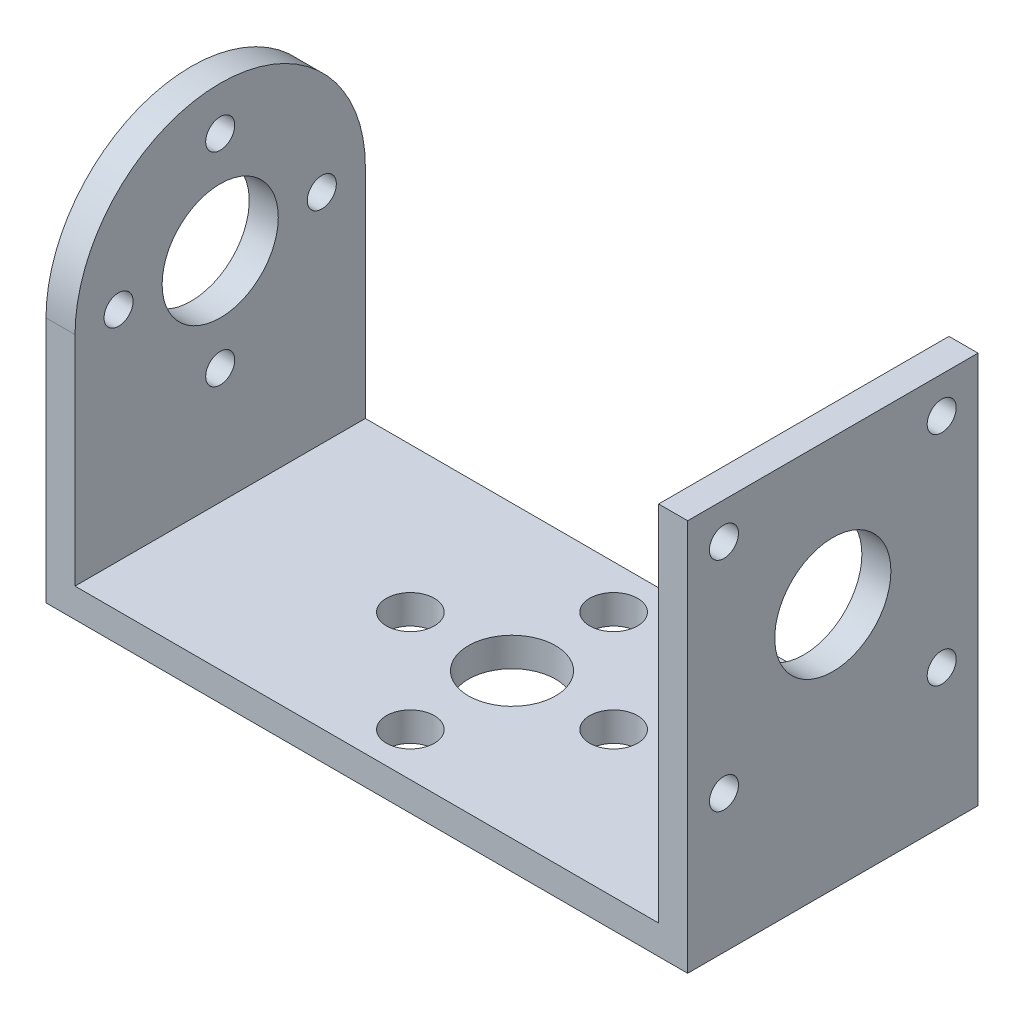
ISO-10303-21;
HEADER;
FILE_DESCRIPTION(('STEP AP214'),'2;1');
FILE_NAME('part.step','',(''),(''),'','','');
FILE_SCHEMA(('AUTOMOTIVE_DESIGN { 1 0 10303 214 1 1 1 1 }'));
ENDSEC;
DATA;
#1=APPLICATION_CONTEXT('core data for automotive mechanical design processes');
#2=APPLICATION_PROTOCOL_DEFINITION('international standard','automotive_design',2000,#1);
#3=PRODUCT_CONTEXT('',#1,'mechanical');
#4=PRODUCT('Part','Part','',(#3));
#5=PRODUCT_RELATED_PRODUCT_CATEGORY('part','',(#4));
#6=PRODUCT_DEFINITION_FORMATION('','',#4);
#7=PRODUCT_DEFINITION_CONTEXT('part definition',#1,'design');
#8=PRODUCT_DEFINITION('design','',#6,#7);
#9=PRODUCT_DEFINITION_SHAPE('','',#8);
#10=(LENGTH_UNIT() NAMED_UNIT(*) SI_UNIT(.MILLI.,.METRE.));
#11=(NAMED_UNIT(*) PLANE_ANGLE_UNIT() SI_UNIT($,.RADIAN.));
#12=(NAMED_UNIT(*) SI_UNIT($,.STERADIAN.) SOLID_ANGLE_UNIT());
#13=UNCERTAINTY_MEASURE_WITH_UNIT(LENGTH_MEASURE(1.E-05),#10,'distance_accuracy_value','');
#14=(GEOMETRIC_REPRESENTATION_CONTEXT(3) GLOBAL_UNCERTAINTY_ASSIGNED_CONTEXT((#13)) GLOBAL_UNIT_ASSIGNED_CONTEXT((#10,
#11,#12)) REPRESENTATION_CONTEXT('',''));
#15=CARTESIAN_POINT('',(0.,0.,0.));
#16=DIRECTION('',(0.,0.,1.));
#17=DIRECTION('',(1.,0.,0.));
#18=AXIS2_PLACEMENT_3D('',#15,#16,#17);
#19=CARTESIAN_POINT('',(-22.1,2.,10.));
#20=DIRECTION('',(1.,0.,0.));
#21=DIRECTION('',(0.,0.,-1.));
#22=AXIS2_PLACEMENT_3D('',#19,#20,#21);
#23=PLANE('',#22);
#24=CARTESIAN_POINT('',(-22.1,17.,0.));
#25=DIRECTION('',(-1.,0.,0.));
#26=DIRECTION('',(0.,0.,1.));
#27=AXIS2_PLACEMENT_3D('',#24,#25,#26);
#28=CIRCLE('',#27,4.);
#29=CARTESIAN_POINT('',(-22.1,17.,4.));
#30=VERTEX_POINT('',#29);
#31=EDGE_CURVE('E288',#30,#30,#28,.T.);
#32=ORIENTED_EDGE('',*,*,#31,.F.);
#33=EDGE_LOOP('',(#32));
#34=FACE_BOUND('',#33,.T.);
#35=CARTESIAN_POINT('',(-22.1,10.,3.46818829043387E-13));
#36=DIRECTION('',(-1.,0.,0.));
#37=DIRECTION('',(0.,0.,1.));
#38=AXIS2_PLACEMENT_3D('',#35,#36,#37);
#39=CIRCLE('',#38,1.);
#40=CARTESIAN_POINT('',(-22.1,10.,1.00000000000035));
#41=VERTEX_POINT('',#40);
#42=EDGE_CURVE('E187',#41,#41,#39,.T.);
#43=ORIENTED_EDGE('',*,*,#42,.F.);
#44=EDGE_LOOP('',(#43));
#45=FACE_BOUND('',#44,.T.);
#46=CARTESIAN_POINT('',(-22.1,16.9999999999999,-6.9999999999998));
#47=DIRECTION('',(-1.,0.,0.));
#48=DIRECTION('',(0.,0.,1.));
#49=AXIS2_PLACEMENT_3D('',#46,#47,#48);
#50=CIRCLE('',#49,0.999999999999999);
#51=CARTESIAN_POINT('',(-22.1,16.9999999999999,-5.9999999999998));
#52=VERTEX_POINT('',#51);
#53=EDGE_CURVE('E265',#52,#52,#50,.T.);
#54=ORIENTED_EDGE('',*,*,#53,.F.);
#55=EDGE_LOOP('',(#54));
#56=FACE_BOUND('',#55,.T.);
#57=CARTESIAN_POINT('',(-22.1,24.,0.));
#58=DIRECTION('',(-1.,0.,0.));
#59=DIRECTION('',(0.,0.,1.));
#60=AXIS2_PLACEMENT_3D('',#57,#58,#59);
#61=CIRCLE('',#60,1.);
#62=CARTESIAN_POINT('',(-22.1,24.,1.));
#63=VERTEX_POINT('',#62);
#64=EDGE_CURVE('E272',#63,#63,#61,.T.);
#65=ORIENTED_EDGE('',*,*,#64,.F.);
#66=EDGE_LOOP('',(#65));
#67=FACE_BOUND('',#66,.T.);
#68=CARTESIAN_POINT('',(-22.1,17.0000000000002,7.0000000000002));
#69=DIRECTION('',(-1.,0.,0.));
#70=DIRECTION('',(0.,0.,1.));
#71=AXIS2_PLACEMENT_3D('',#68,#69,#70);
#72=CIRCLE('',#71,1.);
#73=CARTESIAN_POINT('',(-22.1,17.0000000000002,8.0000000000002));
#74=VERTEX_POINT('',#73);
#75=EDGE_CURVE('E278',#74,#74,#72,.T.);
#76=ORIENTED_EDGE('',*,*,#75,.F.);
#77=EDGE_LOOP('',(#76));
#78=FACE_BOUND('',#77,.T.);
#79=CARTESIAN_POINT('',(-22.1,17.,0.));
#80=DIRECTION('',(-1.,0.,0.));
#81=DIRECTION('',(0.,0.,1.));
#82=AXIS2_PLACEMENT_3D('',#79,#80,#81);
#83=CIRCLE('',#82,10.);
#84=CARTESIAN_POINT('',(-22.1,17.,10.));
#85=VERTEX_POINT('',#84);
#86=CARTESIAN_POINT('',(-22.1,17.,-10.));
#87=VERTEX_POINT('',#86);
#88=EDGE_CURVE('E173',#85,#87,#83,.T.);
#89=ORIENTED_EDGE('',*,*,#88,.T.);
#90=DIRECTION('',(0.,-1.,0.));
#91=VECTOR('',#90,1.);
#92=CARTESIAN_POINT('',(-22.1,2.,-10.));
#93=LINE('',#92,#91);
#94=CARTESIAN_POINT('',(-22.1,0.,-10.));
#95=VERTEX_POINT('',#94);
#96=EDGE_CURVE('E116',#87,#95,#93,.T.);
#97=ORIENTED_EDGE('',*,*,#96,.T.);
#98=DIRECTION('',(0.,0.,1.));
#99=VECTOR('',#98,1.);
#100=CARTESIAN_POINT('',(-22.1,0.,10.));
#101=LINE('',#100,#99);
#102=CARTESIAN_POINT('',(-22.1,0.,10.));
#103=VERTEX_POINT('',#102);
#104=EDGE_CURVE('E200',#95,#103,#101,.T.);
#105=ORIENTED_EDGE('',*,*,#104,.T.);
#106=DIRECTION('',(0.,-1.,0.));
#107=VECTOR('',#106,1.);
#108=CARTESIAN_POINT('',(-22.1,2.,10.));
#109=LINE('',#108,#107);
#110=EDGE_CURVE('E178',#85,#103,#109,.T.);
#111=ORIENTED_EDGE('',*,*,#110,.F.);
#112=EDGE_LOOP('',(#89,#97,#105,#111));
#113=FACE_BOUND('',#112,.T.);
#114=ADVANCED_FACE('F108',(#34,#45,#56,#67,#78,#113),#23,.F.);
#115=CARTESIAN_POINT('',(-20.1,0.,0.));
#116=DIRECTION('',(1.,0.,0.));
#117=DIRECTION('',(0.,0.,-1.));
#118=AXIS2_PLACEMENT_3D('',#115,#116,#117);
#119=PLANE('',#118);
#120=CARTESIAN_POINT('',(-20.1,17.,0.));
#121=DIRECTION('',(1.,0.,0.));
#122=DIRECTION('',(0.,0.,-1.));
#123=AXIS2_PLACEMENT_3D('',#120,#121,#122);
#124=CIRCLE('',#123,4.);
#125=CARTESIAN_POINT('',(-20.1,17.,-4.));
#126=VERTEX_POINT('',#125);
#127=EDGE_CURVE('E291',#126,#126,#124,.F.);
#128=ORIENTED_EDGE('',*,*,#127,.T.);
#129=EDGE_LOOP('',(#128));
#130=FACE_BOUND('',#129,.T.);
#131=CARTESIAN_POINT('',(-20.1,10.,3.46818829043387E-13));
#132=DIRECTION('',(1.,0.,0.));
#133=DIRECTION('',(0.,0.,-1.));
#134=AXIS2_PLACEMENT_3D('',#131,#132,#133);
#135=CIRCLE('',#134,1.);
#136=CARTESIAN_POINT('',(-20.1,10.,-0.999999999999654));
#137=VERTEX_POINT('',#136);
#138=EDGE_CURVE('E285',#137,#137,#135,.F.);
#139=ORIENTED_EDGE('',*,*,#138,.T.);
#140=EDGE_LOOP('',(#139));
#141=FACE_BOUND('',#140,.T.);
#142=CARTESIAN_POINT('',(-20.1,17.0000000000002,7.0000000000002));
#143=DIRECTION('',(1.,0.,0.));
#144=DIRECTION('',(0.,0.,-1.));
#145=AXIS2_PLACEMENT_3D('',#142,#143,#144);
#146=CIRCLE('',#145,1.);
#147=CARTESIAN_POINT('',(-20.1,17.0000000000002,6.0000000000002));
#148=VERTEX_POINT('',#147);
#149=EDGE_CURVE('E186',#148,#148,#146,.F.);
#150=ORIENTED_EDGE('',*,*,#149,.T.);
#151=EDGE_LOOP('',(#150));
#152=FACE_BOUND('',#151,.T.);
#153=CARTESIAN_POINT('',(-20.1,24.,0.));
#154=DIRECTION('',(1.,0.,0.));
#155=DIRECTION('',(0.,0.,-1.));
#156=AXIS2_PLACEMENT_3D('',#153,#154,#155);
#157=CIRCLE('',#156,1.);
#158=CARTESIAN_POINT('',(-20.1,24.,-1.));
#159=VERTEX_POINT('',#158);
#160=EDGE_CURVE('E275',#159,#159,#157,.F.);
#161=ORIENTED_EDGE('',*,*,#160,.T.);
#162=EDGE_LOOP('',(#161));
#163=FACE_BOUND('',#162,.T.);
#164=CARTESIAN_POINT('',(-20.1,16.9999999999999,-6.9999999999998));
#165=DIRECTION('',(1.,0.,0.));
#166=DIRECTION('',(0.,0.,-1.));
#167=AXIS2_PLACEMENT_3D('',#164,#165,#166);
#168=CIRCLE('',#167,0.999999999999999);
#169=CARTESIAN_POINT('',(-20.1,16.9999999999999,-7.9999999999998));
#170=VERTEX_POINT('',#169);
#171=EDGE_CURVE('E269',#170,#170,#168,.F.);
#172=ORIENTED_EDGE('',*,*,#171,.T.);
#173=EDGE_LOOP('',(#172));
#174=FACE_BOUND('',#173,.T.);
#175=DIRECTION('',(0.,-1.,0.));
#176=VECTOR('',#175,1.);
#177=CARTESIAN_POINT('',(-20.1,2.,-10.));
#178=LINE('',#177,#176);
#179=CARTESIAN_POINT('',(-20.1,17.,-10.));
#180=VERTEX_POINT('',#179);
#181=CARTESIAN_POINT('',(-20.1,2.,-10.));
#182=VERTEX_POINT('',#181);
#183=EDGE_CURVE('E244',#180,#182,#178,.T.);
#184=ORIENTED_EDGE('',*,*,#183,.F.);
#185=CARTESIAN_POINT('',(-20.1,17.,0.));
#186=DIRECTION('',(1.,0.,0.));
#187=DIRECTION('',(0.,0.,-1.));
#188=AXIS2_PLACEMENT_3D('',#185,#186,#187);
#189=CIRCLE('',#188,10.);
#190=CARTESIAN_POINT('',(-20.1,17.,10.));
#191=VERTEX_POINT('',#190);
#192=EDGE_CURVE('E179',#191,#180,#189,.F.);
#193=ORIENTED_EDGE('',*,*,#192,.F.);
#194=DIRECTION('',(0.,1.,0.));
#195=VECTOR('',#194,1.);
#196=CARTESIAN_POINT('',(-20.1,2.,10.));
#197=LINE('',#196,#195);
#198=CARTESIAN_POINT('',(-20.1,2.,10.));
#199=VERTEX_POINT('',#198);
#200=EDGE_CURVE('E232',#199,#191,#197,.T.);
#201=ORIENTED_EDGE('',*,*,#200,.F.);
#202=DIRECTION('',(0.,0.,1.));
#203=VECTOR('',#202,1.);
#204=CARTESIAN_POINT('',(-20.1,2.,-10.));
#205=LINE('',#204,#203);
#206=EDGE_CURVE('E242',#182,#199,#205,.T.);
#207=ORIENTED_EDGE('',*,*,#206,.F.);
#208=EDGE_LOOP('',(#184,#193,#201,#207));
#209=FACE_BOUND('',#208,.T.);
#210=ADVANCED_FACE('F362',(#130,#141,#152,#163,#174,#209),#119,.T.);
#211=CARTESIAN_POINT('',(-22.1,2.,-10.));
#212=DIRECTION('',(0.,0.,1.));
#213=DIRECTION('',(1.,0.,0.));
#214=AXIS2_PLACEMENT_3D('',#211,#212,#213);
#215=PLANE('',#214);
#216=DIRECTION('',(-1.,0.,0.));
#217=VECTOR('',#216,1.);
#218=CARTESIAN_POINT('',(22.101,17.,-10.));
#219=LINE('',#218,#217);
#220=EDGE_CURVE('E182',#180,#87,#219,.T.);
#221=ORIENTED_EDGE('',*,*,#220,.F.);
#222=ORIENTED_EDGE('',*,*,#183,.T.);
#223=DIRECTION('',(-1.,0.,0.));
#224=VECTOR('',#223,1.);
#225=CARTESIAN_POINT('',(-22.1,2.,-10.));
#226=LINE('',#225,#224);
#227=CARTESIAN_POINT('',(20.1,2.,-10.));
#228=VERTEX_POINT('',#227);
#229=EDGE_CURVE('E199',#228,#182,#226,.T.);
#230=ORIENTED_EDGE('',*,*,#229,.F.);
#231=DIRECTION('',(0.,-1.,0.));
#232=VECTOR('',#231,1.);
#233=CARTESIAN_POINT('',(20.1,2.,-10.));
#234=LINE('',#233,#232);
#235=CARTESIAN_POINT('',(20.1,27.,-10.));
#236=VERTEX_POINT('',#235);
#237=EDGE_CURVE('E256',#236,#228,#234,.T.);
#238=ORIENTED_EDGE('',*,*,#237,.F.);
#239=DIRECTION('',(1.,0.,0.));
#240=VECTOR('',#239,1.);
#241=CARTESIAN_POINT('',(20.1,27.,-10.));
#242=LINE('',#241,#240);
#243=CARTESIAN_POINT('',(22.1,27.,-10.));
#244=VERTEX_POINT('',#243);
#245=EDGE_CURVE('E247',#236,#244,#242,.T.);
#246=ORIENTED_EDGE('',*,*,#245,.T.);
#247=DIRECTION('',(0.,-1.,0.));
#248=VECTOR('',#247,1.);
#249=CARTESIAN_POINT('',(22.1,2.,-10.));
#250=LINE('',#249,#248);
#251=CARTESIAN_POINT('',(22.1,0.,-10.));
#252=VERTEX_POINT('',#251);
#253=EDGE_CURVE('E12',#244,#252,#250,.T.);
#254=ORIENTED_EDGE('',*,*,#253,.T.);
#255=DIRECTION('',(-1.,0.,0.));
#256=VECTOR('',#255,1.);
#257=CARTESIAN_POINT('',(-22.1,0.,-10.));
#258=LINE('',#257,#256);
#259=EDGE_CURVE('E190',#252,#95,#258,.T.);
#260=ORIENTED_EDGE('',*,*,#259,.T.);
#261=ORIENTED_EDGE('',*,*,#96,.F.);
#262=EDGE_LOOP('',(#221,#222,#230,#238,#246,#254,#260,#261));
#263=FACE_BOUND('',#262,.T.);
#264=ADVANCED_FACE('F189',(#263),#215,.F.);
#265=CARTESIAN_POINT('',(22.1,2.,10.));
#266=DIRECTION('',(-1.,0.,0.));
#267=DIRECTION('',(0.,0.,1.));
#268=AXIS2_PLACEMENT_3D('',#265,#266,#267);
#269=PLANE('',#268);
#270=CARTESIAN_POINT('',(22.1,24.5,7.5));
#271=DIRECTION('',(1.,0.,0.));
#272=DIRECTION('',(0.,0.,-1.));
#273=AXIS2_PLACEMENT_3D('',#270,#271,#272);
#274=CIRCLE('',#273,1.);
#275=CARTESIAN_POINT('',(22.1,24.5,6.5));
#276=VERTEX_POINT('',#275);
#277=EDGE_CURVE('E298',#276,#276,#274,.T.);
#278=ORIENTED_EDGE('',*,*,#277,.F.);
#279=EDGE_LOOP('',(#278));
#280=FACE_BOUND('',#279,.T.);
#281=CARTESIAN_POINT('',(22.1,24.5,-7.5));
#282=DIRECTION('',(1.,0.,0.));
#283=DIRECTION('',(0.,0.,-1.));
#284=AXIS2_PLACEMENT_3D('',#281,#282,#283);
#285=CIRCLE('',#284,1.);
#286=CARTESIAN_POINT('',(22.1,24.5,-8.5));
#287=VERTEX_POINT('',#286);
#288=EDGE_CURVE('E314',#287,#287,#285,.T.);
#289=ORIENTED_EDGE('',*,*,#288,.F.);
#290=EDGE_LOOP('',(#289));
#291=FACE_BOUND('',#290,.T.);
#292=CARTESIAN_POINT('',(22.1,9.5,-7.50000000000016));
#293=DIRECTION('',(1.,0.,0.));
#294=DIRECTION('',(0.,0.,-1.));
#295=AXIS2_PLACEMENT_3D('',#292,#293,#294);
#296=CIRCLE('',#295,1.);
#297=CARTESIAN_POINT('',(22.1,9.5,-8.50000000000016));
#298=VERTEX_POINT('',#297);
#299=EDGE_CURVE('E310',#298,#298,#296,.T.);
#300=ORIENTED_EDGE('',*,*,#299,.F.);
#301=EDGE_LOOP('',(#300));
#302=FACE_BOUND('',#301,.T.);
#303=CARTESIAN_POINT('',(22.1,9.5,7.49999999999984));
#304=DIRECTION('',(1.,0.,0.));
#305=DIRECTION('',(0.,0.,-1.));
#306=AXIS2_PLACEMENT_3D('',#303,#304,#305);
#307=CIRCLE('',#306,1.);
#308=CARTESIAN_POINT('',(22.1,9.5,6.49999999999984));
#309=VERTEX_POINT('',#308);
#310=EDGE_CURVE('E304',#309,#309,#307,.T.);
#311=ORIENTED_EDGE('',*,*,#310,.F.);
#312=EDGE_LOOP('',(#311));
#313=FACE_BOUND('',#312,.T.);
#314=CARTESIAN_POINT('',(22.1,17.,0.));
#315=DIRECTION('',(1.,0.,0.));
#316=DIRECTION('',(0.,0.,-1.));
#317=AXIS2_PLACEMENT_3D('',#314,#315,#316);
#318=CIRCLE('',#317,4.);
#319=CARTESIAN_POINT('',(22.1,17.,-4.));
#320=VERTEX_POINT('',#319);
#321=EDGE_CURVE('E294',#320,#320,#318,.T.);
#322=ORIENTED_EDGE('',*,*,#321,.F.);
#323=EDGE_LOOP('',(#322));
#324=FACE_BOUND('',#323,.T.);
#325=DIRECTION('',(0.,0.,-1.));
#326=VECTOR('',#325,1.);
#327=CARTESIAN_POINT('',(22.1,0.,10.));
#328=LINE('',#327,#326);
#329=CARTESIAN_POINT('',(22.1,0.,10.));
#330=VERTEX_POINT('',#329);
#331=EDGE_CURVE('E203',#330,#252,#328,.T.);
#332=ORIENTED_EDGE('',*,*,#331,.T.);
#333=ORIENTED_EDGE('',*,*,#253,.F.);
#334=DIRECTION('',(0.,0.,-1.));
#335=VECTOR('',#334,1.);
#336=CARTESIAN_POINT('',(22.1,27.,-10.));
#337=LINE('',#336,#335);
#338=CARTESIAN_POINT('',(22.1,27.,10.));
#339=VERTEX_POINT('',#338);
#340=EDGE_CURVE('E253',#339,#244,#337,.T.);
#341=ORIENTED_EDGE('',*,*,#340,.F.);
#342=DIRECTION('',(0.,-1.,0.));
#343=VECTOR('',#342,1.);
#344=CARTESIAN_POINT('',(22.1,2.,10.));
#345=LINE('',#344,#343);
#346=EDGE_CURVE('E192',#339,#330,#345,.T.);
#347=ORIENTED_EDGE('',*,*,#346,.T.);
#348=EDGE_LOOP('',(#332,#333,#341,#347));
#349=FACE_BOUND('',#348,.T.);
#350=ADVANCED_FACE('F110',(#280,#291,#302,#313,#324,#349),#269,.F.);
#351=CARTESIAN_POINT('',(-22.1,2.,10.));
#352=DIRECTION('',(0.,0.,-1.));
#353=DIRECTION('',(-1.,0.,0.));
#354=AXIS2_PLACEMENT_3D('',#351,#352,#353);
#355=PLANE('',#354);
#356=ORIENTED_EDGE('',*,*,#200,.T.);
#357=DIRECTION('',(-1.,0.,0.));
#358=VECTOR('',#357,1.);
#359=CARTESIAN_POINT('',(22.101,17.,10.));
#360=LINE('',#359,#358);
#361=EDGE_CURVE('E123',#191,#85,#360,.T.);
#362=ORIENTED_EDGE('',*,*,#361,.T.);
#363=ORIENTED_EDGE('',*,*,#110,.T.);
#364=DIRECTION('',(1.,0.,0.));
#365=VECTOR('',#364,1.);
#366=CARTESIAN_POINT('',(-22.1,0.,10.));
#367=LINE('',#366,#365);
#368=EDGE_CURVE('E197',#103,#330,#367,.T.);
#369=ORIENTED_EDGE('',*,*,#368,.T.);
#370=ORIENTED_EDGE('',*,*,#346,.F.);
#371=DIRECTION('',(1.,0.,0.));
#372=VECTOR('',#371,1.);
#373=CARTESIAN_POINT('',(20.1,27.,10.));
#374=LINE('',#373,#372);
#375=CARTESIAN_POINT('',(20.1,27.,10.));
#376=VERTEX_POINT('',#375);
#377=EDGE_CURVE('E246',#376,#339,#374,.T.);
#378=ORIENTED_EDGE('',*,*,#377,.F.);
#379=DIRECTION('',(0.,1.,0.));
#380=VECTOR('',#379,1.);
#381=CARTESIAN_POINT('',(20.1,2.,10.));
#382=LINE('',#381,#380);
#383=CARTESIAN_POINT('',(20.1,2.,10.));
#384=VERTEX_POINT('',#383);
#385=EDGE_CURVE('E258',#384,#376,#382,.T.);
#386=ORIENTED_EDGE('',*,*,#385,.F.);
#387=DIRECTION('',(1.,0.,0.));
#388=VECTOR('',#387,1.);
#389=CARTESIAN_POINT('',(-22.1,2.,10.));
#390=LINE('',#389,#388);
#391=EDGE_CURVE('E131',#199,#384,#390,.T.);
#392=ORIENTED_EDGE('',*,*,#391,.F.);
#393=EDGE_LOOP('',(#356,#362,#363,#369,#370,#378,#386,#392));
#394=FACE_BOUND('',#393,.T.);
#395=ADVANCED_FACE('F337',(#394),#355,.F.);
#396=CARTESIAN_POINT('',(0.,2.,0.));
#397=DIRECTION('',(0.,-1.,0.));
#398=DIRECTION('',(0.,0.,-1.));
#399=AXIS2_PLACEMENT_3D('',#396,#397,#398);
#400=PLANE('',#399);
#401=CARTESIAN_POINT('',(-7.,2.,0.));
#402=DIRECTION('',(0.,1.,0.));
#403=DIRECTION('',(0.,0.,1.));
#404=AXIS2_PLACEMENT_3D('',#401,#402,#403);
#405=CIRCLE('',#404,1.65);
#406=CARTESIAN_POINT('',(-7.,2.,1.65));
#407=VERTEX_POINT('',#406);
#408=EDGE_CURVE('E231',#407,#407,#405,.T.);
#409=ORIENTED_EDGE('',*,*,#408,.F.);
#410=EDGE_LOOP('',(#409));
#411=FACE_BOUND('',#410,.T.);
#412=CARTESIAN_POINT('',(0.,2.,7.));
#413=DIRECTION('',(0.,1.,0.));
#414=DIRECTION('',(0.,0.,1.));
#415=AXIS2_PLACEMENT_3D('',#412,#413,#414);
#416=CIRCLE('',#415,1.65);
#417=CARTESIAN_POINT('',(0.,2.,8.65));
#418=VERTEX_POINT('',#417);
#419=EDGE_CURVE('E220',#418,#418,#416,.T.);
#420=ORIENTED_EDGE('',*,*,#419,.F.);
#421=EDGE_LOOP('',(#420));
#422=FACE_BOUND('',#421,.T.);
#423=CARTESIAN_POINT('',(0.,2.,-7.));
#424=DIRECTION('',(0.,1.,0.));
#425=DIRECTION('',(0.,0.,1.));
#426=AXIS2_PLACEMENT_3D('',#423,#424,#425);
#427=CIRCLE('',#426,1.65);
#428=CARTESIAN_POINT('',(0.,2.,-5.35));
#429=VERTEX_POINT('',#428);
#430=EDGE_CURVE('E219',#429,#429,#427,.T.);
#431=ORIENTED_EDGE('',*,*,#430,.F.);
#432=EDGE_LOOP('',(#431));
#433=FACE_BOUND('',#432,.T.);
#434=CARTESIAN_POINT('',(0.,2.,0.));
#435=DIRECTION('',(0.,1.,0.));
#436=DIRECTION('',(0.,0.,1.));
#437=AXIS2_PLACEMENT_3D('',#434,#435,#436);
#438=CIRCLE('',#437,3.);
#439=CARTESIAN_POINT('',(0.,2.,3.));
#440=VERTEX_POINT('',#439);
#441=EDGE_CURVE('E213',#440,#440,#438,.T.);
#442=ORIENTED_EDGE('',*,*,#441,.F.);
#443=EDGE_LOOP('',(#442));
#444=FACE_BOUND('',#443,.T.);
#445=CARTESIAN_POINT('',(7.,2.,0.));
#446=DIRECTION('',(0.,1.,0.));
#447=DIRECTION('',(0.,0.,1.));
#448=AXIS2_PLACEMENT_3D('',#445,#446,#447);
#449=CIRCLE('',#448,1.65);
#450=CARTESIAN_POINT('',(7.,2.,1.65));
#451=VERTEX_POINT('',#450);
#452=EDGE_CURVE('E206',#451,#451,#449,.T.);
#453=ORIENTED_EDGE('',*,*,#452,.F.);
#454=EDGE_LOOP('',(#453));
#455=FACE_BOUND('',#454,.T.);
#456=ORIENTED_EDGE('',*,*,#391,.T.);
#457=DIRECTION('',(0.,0.,1.));
#458=VECTOR('',#457,1.);
#459=CARTESIAN_POINT('',(20.1,2.,-10.));
#460=LINE('',#459,#458);
#461=EDGE_CURVE('E250',#228,#384,#460,.T.);
#462=ORIENTED_EDGE('',*,*,#461,.F.);
#463=ORIENTED_EDGE('',*,*,#229,.T.);
#464=ORIENTED_EDGE('',*,*,#206,.T.);
#465=EDGE_LOOP('',(#456,#462,#463,#464));
#466=FACE_BOUND('',#465,.T.);
#467=ADVANCED_FACE('F363',(#411,#422,#433,#444,#455,#466),#400,.F.);
#468=CARTESIAN_POINT('',(0.,0.,0.));
#469=DIRECTION('',(0.,-1.,0.));
#470=DIRECTION('',(0.,0.,-1.));
#471=AXIS2_PLACEMENT_3D('',#468,#469,#470);
#472=PLANE('',#471);
#473=CARTESIAN_POINT('',(-7.,0.,0.));
#474=DIRECTION('',(0.,-1.,0.));
#475=DIRECTION('',(0.,0.,-1.));
#476=AXIS2_PLACEMENT_3D('',#473,#474,#475);
#477=CIRCLE('',#476,1.65);
#478=CARTESIAN_POINT('',(-7.,0.,-1.65));
#479=VERTEX_POINT('',#478);
#480=EDGE_CURVE('E228',#479,#479,#477,.F.);
#481=ORIENTED_EDGE('',*,*,#480,.T.);
#482=EDGE_LOOP('',(#481));
#483=FACE_BOUND('',#482,.T.);
#484=CARTESIAN_POINT('',(0.,0.,7.));
#485=DIRECTION('',(0.,-1.,0.));
#486=DIRECTION('',(0.,0.,-1.));
#487=AXIS2_PLACEMENT_3D('',#484,#485,#486);
#488=CIRCLE('',#487,1.65);
#489=CARTESIAN_POINT('',(0.,0.,5.35));
#490=VERTEX_POINT('',#489);
#491=EDGE_CURVE('E235',#490,#490,#488,.F.);
#492=ORIENTED_EDGE('',*,*,#491,.T.);
#493=EDGE_LOOP('',(#492));
#494=FACE_BOUND('',#493,.T.);
#495=CARTESIAN_POINT('',(0.,0.,-7.));
#496=DIRECTION('',(0.,-1.,0.));
#497=DIRECTION('',(0.,0.,-1.));
#498=AXIS2_PLACEMENT_3D('',#495,#496,#497);
#499=CIRCLE('',#498,1.65);
#500=CARTESIAN_POINT('',(0.,0.,-8.65));
#501=VERTEX_POINT('',#500);
#502=EDGE_CURVE('E216',#501,#501,#499,.F.);
#503=ORIENTED_EDGE('',*,*,#502,.T.);
#504=EDGE_LOOP('',(#503));
#505=FACE_BOUND('',#504,.T.);
#506=CARTESIAN_POINT('',(0.,0.,0.));
#507=DIRECTION('',(0.,-1.,0.));
#508=DIRECTION('',(0.,0.,-1.));
#509=AXIS2_PLACEMENT_3D('',#506,#507,#508);
#510=CIRCLE('',#509,3.);
#511=CARTESIAN_POINT('',(0.,0.,-3.));
#512=VERTEX_POINT('',#511);
#513=EDGE_CURVE('E223',#512,#512,#510,.F.);
#514=ORIENTED_EDGE('',*,*,#513,.T.);
#515=EDGE_LOOP('',(#514));
#516=FACE_BOUND('',#515,.T.);
#517=CARTESIAN_POINT('',(7.,0.,0.));
#518=DIRECTION('',(0.,-1.,0.));
#519=DIRECTION('',(0.,0.,-1.));
#520=AXIS2_PLACEMENT_3D('',#517,#518,#519);
#521=CIRCLE('',#520,1.65);
#522=CARTESIAN_POINT('',(7.,0.,-1.65));
#523=VERTEX_POINT('',#522);
#524=EDGE_CURVE('E210',#523,#523,#521,.F.);
#525=ORIENTED_EDGE('',*,*,#524,.T.);
#526=EDGE_LOOP('',(#525));
#527=FACE_BOUND('',#526,.T.);
#528=ORIENTED_EDGE('',*,*,#331,.F.);
#529=ORIENTED_EDGE('',*,*,#368,.F.);
#530=ORIENTED_EDGE('',*,*,#104,.F.);
#531=ORIENTED_EDGE('',*,*,#259,.F.);
#532=EDGE_LOOP('',(#528,#529,#530,#531));
#533=FACE_BOUND('',#532,.T.);
#534=ADVANCED_FACE('F350',(#483,#494,#505,#516,#527,#533),#472,.T.);
#535=CARTESIAN_POINT('',(7.,-0.00100000000000013,0.));
#536=DIRECTION('',(0.,1.,0.));
#537=DIRECTION('',(0.,0.,1.));
#538=AXIS2_PLACEMENT_3D('',#535,#536,#537);
#539=CYLINDRICAL_SURFACE('',#538,1.65);
#540=ORIENTED_EDGE('',*,*,#524,.F.);
#541=EDGE_LOOP('',(#540));
#542=FACE_BOUND('',#541,.T.);
#543=ORIENTED_EDGE('',*,*,#452,.T.);
#544=EDGE_LOOP('',(#543));
#545=FACE_BOUND('',#544,.T.);
#546=ADVANCED_FACE('F418',(#542,#545),#539,.F.);
#547=CARTESIAN_POINT('',(0.,-0.00100000000000013,0.));
#548=DIRECTION('',(0.,1.,0.));
#549=DIRECTION('',(0.,0.,1.));
#550=AXIS2_PLACEMENT_3D('',#547,#548,#549);
#551=CYLINDRICAL_SURFACE('',#550,3.);
#552=ORIENTED_EDGE('',*,*,#513,.F.);
#553=EDGE_LOOP('',(#552));
#554=FACE_BOUND('',#553,.T.);
#555=ORIENTED_EDGE('',*,*,#441,.T.);
#556=EDGE_LOOP('',(#555));
#557=FACE_BOUND('',#556,.T.);
#558=ADVANCED_FACE('F425',(#554,#557),#551,.F.);
#559=CARTESIAN_POINT('',(0.,-0.00100000000000013,-7.));
#560=DIRECTION('',(0.,1.,0.));
#561=DIRECTION('',(0.,0.,1.));
#562=AXIS2_PLACEMENT_3D('',#559,#560,#561);
#563=CYLINDRICAL_SURFACE('',#562,1.65);
#564=ORIENTED_EDGE('',*,*,#502,.F.);
#565=EDGE_LOOP('',(#564));
#566=FACE_BOUND('',#565,.T.);
#567=ORIENTED_EDGE('',*,*,#430,.T.);
#568=EDGE_LOOP('',(#567));
#569=FACE_BOUND('',#568,.T.);
#570=ADVANCED_FACE('F433',(#566,#569),#563,.F.);
#571=CARTESIAN_POINT('',(0.,-0.00100000000000013,7.));
#572=DIRECTION('',(0.,1.,0.));
#573=DIRECTION('',(0.,0.,1.));
#574=AXIS2_PLACEMENT_3D('',#571,#572,#573);
#575=CYLINDRICAL_SURFACE('',#574,1.65);
#576=ORIENTED_EDGE('',*,*,#491,.F.);
#577=EDGE_LOOP('',(#576));
#578=FACE_BOUND('',#577,.T.);
#579=ORIENTED_EDGE('',*,*,#419,.T.);
#580=EDGE_LOOP('',(#579));
#581=FACE_BOUND('',#580,.T.);
#582=ADVANCED_FACE('F441',(#578,#581),#575,.F.);
#583=CARTESIAN_POINT('',(-7.,-0.00100000000000013,0.));
#584=DIRECTION('',(0.,1.,0.));
#585=DIRECTION('',(0.,0.,1.));
#586=AXIS2_PLACEMENT_3D('',#583,#584,#585);
#587=CYLINDRICAL_SURFACE('',#586,1.65);
#588=ORIENTED_EDGE('',*,*,#480,.F.);
#589=EDGE_LOOP('',(#588));
#590=FACE_BOUND('',#589,.T.);
#591=ORIENTED_EDGE('',*,*,#408,.T.);
#592=EDGE_LOOP('',(#591));
#593=FACE_BOUND('',#592,.T.);
#594=ADVANCED_FACE('F373',(#590,#593),#587,.F.);
#595=CARTESIAN_POINT('',(20.1,27.,-10.));
#596=DIRECTION('',(0.,-1.,0.));
#597=DIRECTION('',(0.,0.,-1.));
#598=AXIS2_PLACEMENT_3D('',#595,#596,#597);
#599=PLANE('',#598);
#600=ORIENTED_EDGE('',*,*,#340,.T.);
#601=ORIENTED_EDGE('',*,*,#245,.F.);
#602=DIRECTION('',(0.,0.,-1.));
#603=VECTOR('',#602,1.);
#604=CARTESIAN_POINT('',(20.1,27.,-10.));
#605=LINE('',#604,#603);
#606=EDGE_CURVE('E260',#376,#236,#605,.T.);
#607=ORIENTED_EDGE('',*,*,#606,.F.);
#608=ORIENTED_EDGE('',*,*,#377,.T.);
#609=EDGE_LOOP('',(#600,#601,#607,#608));
#610=FACE_BOUND('',#609,.T.);
#611=ADVANCED_FACE('F356',(#610),#599,.F.);
#612=CARTESIAN_POINT('',(20.1,0.,0.));
#613=DIRECTION('',(-1.,0.,0.));
#614=DIRECTION('',(0.,0.,-1.));
#615=AXIS2_PLACEMENT_3D('',#612,#613,#614);
#616=PLANE('',#615);
#617=CARTESIAN_POINT('',(20.1,24.5,7.5));
#618=DIRECTION('',(-1.,0.,0.));
#619=DIRECTION('',(0.,0.,1.));
#620=AXIS2_PLACEMENT_3D('',#617,#618,#619);
#621=CIRCLE('',#620,1.);
#622=CARTESIAN_POINT('',(20.1,24.5,8.5));
#623=VERTEX_POINT('',#622);
#624=EDGE_CURVE('E317',#623,#623,#621,.F.);
#625=ORIENTED_EDGE('',*,*,#624,.T.);
#626=EDGE_LOOP('',(#625));
#627=FACE_BOUND('',#626,.T.);
#628=CARTESIAN_POINT('',(20.1,24.5,-7.5));
#629=DIRECTION('',(-1.,0.,0.));
#630=DIRECTION('',(0.,0.,1.));
#631=AXIS2_PLACEMENT_3D('',#628,#629,#630);
#632=CIRCLE('',#631,1.);
#633=CARTESIAN_POINT('',(20.1,24.5,-6.5));
#634=VERTEX_POINT('',#633);
#635=EDGE_CURVE('E313',#634,#634,#632,.F.);
#636=ORIENTED_EDGE('',*,*,#635,.T.);
#637=EDGE_LOOP('',(#636));
#638=FACE_BOUND('',#637,.T.);
#639=CARTESIAN_POINT('',(20.1,9.5,-7.50000000000016));
#640=DIRECTION('',(-1.,0.,0.));
#641=DIRECTION('',(0.,0.,1.));
#642=AXIS2_PLACEMENT_3D('',#639,#640,#641);
#643=CIRCLE('',#642,1.);
#644=CARTESIAN_POINT('',(20.1,9.5,-6.50000000000016));
#645=VERTEX_POINT('',#644);
#646=EDGE_CURVE('E307',#645,#645,#643,.F.);
#647=ORIENTED_EDGE('',*,*,#646,.T.);
#648=EDGE_LOOP('',(#647));
#649=FACE_BOUND('',#648,.T.);
#650=CARTESIAN_POINT('',(20.1,9.5,7.49999999999984));
#651=DIRECTION('',(-1.,0.,0.));
#652=DIRECTION('',(0.,0.,1.));
#653=AXIS2_PLACEMENT_3D('',#650,#651,#652);
#654=CIRCLE('',#653,1.);
#655=CARTESIAN_POINT('',(20.1,9.5,8.49999999999984));
#656=VERTEX_POINT('',#655);
#657=EDGE_CURVE('E301',#656,#656,#654,.F.);
#658=ORIENTED_EDGE('',*,*,#657,.T.);
#659=EDGE_LOOP('',(#658));
#660=FACE_BOUND('',#659,.T.);
#661=CARTESIAN_POINT('',(20.1,17.,0.));
#662=DIRECTION('',(-1.,0.,0.));
#663=DIRECTION('',(0.,0.,1.));
#664=AXIS2_PLACEMENT_3D('',#661,#662,#663);
#665=CIRCLE('',#664,4.);
#666=CARTESIAN_POINT('',(20.1,17.,4.));
#667=VERTEX_POINT('',#666);
#668=EDGE_CURVE('E295',#667,#667,#665,.F.);
#669=ORIENTED_EDGE('',*,*,#668,.T.);
#670=EDGE_LOOP('',(#669));
#671=FACE_BOUND('',#670,.T.);
#672=ORIENTED_EDGE('',*,*,#237,.T.);
#673=ORIENTED_EDGE('',*,*,#461,.T.);
#674=ORIENTED_EDGE('',*,*,#385,.T.);
#675=ORIENTED_EDGE('',*,*,#606,.T.);
#676=EDGE_LOOP('',(#672,#673,#674,#675));
#677=FACE_BOUND('',#676,.T.);
#678=ADVANCED_FACE('F325',(#627,#638,#649,#660,#671,#677),#616,.T.);
#679=CARTESIAN_POINT('',(22.101,17.,0.));
#680=DIRECTION('',(-1.,0.,0.));
#681=DIRECTION('',(0.,0.,1.));
#682=AXIS2_PLACEMENT_3D('',#679,#680,#681);
#683=CYLINDRICAL_SURFACE('',#682,10.);
#684=ORIENTED_EDGE('',*,*,#192,.T.);
#685=ORIENTED_EDGE('',*,*,#220,.T.);
#686=ORIENTED_EDGE('',*,*,#88,.F.);
#687=ORIENTED_EDGE('',*,*,#361,.F.);
#688=EDGE_LOOP('',(#684,#685,#686,#687));
#689=FACE_BOUND('',#688,.T.);
#690=ADVANCED_FACE('F183',(#689),#683,.T.);
#691=CARTESIAN_POINT('',(22.101,16.9999999999999,-6.9999999999998));
#692=DIRECTION('',(-1.,0.,0.));
#693=DIRECTION('',(0.,0.,1.));
#694=AXIS2_PLACEMENT_3D('',#691,#692,#693);
#695=CYLINDRICAL_SURFACE('',#694,0.999999999999999);
#696=ORIENTED_EDGE('',*,*,#171,.F.);
#697=EDGE_LOOP('',(#696));
#698=FACE_BOUND('',#697,.T.);
#699=ORIENTED_EDGE('',*,*,#53,.T.);
#700=EDGE_LOOP('',(#699));
#701=FACE_BOUND('',#700,.T.);
#702=ADVANCED_FACE('F371',(#698,#701),#695,.F.);
#703=CARTESIAN_POINT('',(22.101,24.,0.));
#704=DIRECTION('',(-1.,0.,0.));
#705=DIRECTION('',(0.,0.,1.));
#706=AXIS2_PLACEMENT_3D('',#703,#704,#705);
#707=CYLINDRICAL_SURFACE('',#706,1.);
#708=ORIENTED_EDGE('',*,*,#160,.F.);
#709=EDGE_LOOP('',(#708));
#710=FACE_BOUND('',#709,.T.);
#711=ORIENTED_EDGE('',*,*,#64,.T.);
#712=EDGE_LOOP('',(#711));
#713=FACE_BOUND('',#712,.T.);
#714=ADVANCED_FACE('F547',(#710,#713),#707,.F.);
#715=CARTESIAN_POINT('',(22.101,17.0000000000002,7.0000000000002));
#716=DIRECTION('',(-1.,0.,0.));
#717=DIRECTION('',(0.,0.,1.));
#718=AXIS2_PLACEMENT_3D('',#715,#716,#717);
#719=CYLINDRICAL_SURFACE('',#718,1.);
#720=ORIENTED_EDGE('',*,*,#149,.F.);
#721=EDGE_LOOP('',(#720));
#722=FACE_BOUND('',#721,.T.);
#723=ORIENTED_EDGE('',*,*,#75,.T.);
#724=EDGE_LOOP('',(#723));
#725=FACE_BOUND('',#724,.T.);
#726=ADVANCED_FACE('F543',(#722,#725),#719,.F.);
#727=CARTESIAN_POINT('',(22.101,10.,3.46818829043387E-13));
#728=DIRECTION('',(-1.,0.,0.));
#729=DIRECTION('',(0.,0.,1.));
#730=AXIS2_PLACEMENT_3D('',#727,#728,#729);
#731=CYLINDRICAL_SURFACE('',#730,1.);
#732=ORIENTED_EDGE('',*,*,#138,.F.);
#733=EDGE_LOOP('',(#732));
#734=FACE_BOUND('',#733,.T.);
#735=ORIENTED_EDGE('',*,*,#42,.T.);
#736=EDGE_LOOP('',(#735));
#737=FACE_BOUND('',#736,.T.);
#738=ADVANCED_FACE('F539',(#734,#737),#731,.F.);
#739=CARTESIAN_POINT('',(22.101,17.,0.));
#740=DIRECTION('',(-1.,0.,0.));
#741=DIRECTION('',(0.,0.,1.));
#742=AXIS2_PLACEMENT_3D('',#739,#740,#741);
#743=CYLINDRICAL_SURFACE('',#742,4.);
#744=ORIENTED_EDGE('',*,*,#127,.F.);
#745=EDGE_LOOP('',(#744));
#746=FACE_BOUND('',#745,.T.);
#747=ORIENTED_EDGE('',*,*,#31,.T.);
#748=EDGE_LOOP('',(#747));
#749=FACE_BOUND('',#748,.T.);
#750=ADVANCED_FACE('F494',(#746,#749),#743,.F.);
#751=CARTESIAN_POINT('',(-22.101,17.,0.));
#752=DIRECTION('',(1.,0.,0.));
#753=DIRECTION('',(0.,0.,-1.));
#754=AXIS2_PLACEMENT_3D('',#751,#752,#753);
#755=CYLINDRICAL_SURFACE('',#754,4.);
#756=ORIENTED_EDGE('',*,*,#668,.F.);
#757=EDGE_LOOP('',(#756));
#758=FACE_BOUND('',#757,.T.);
#759=ORIENTED_EDGE('',*,*,#321,.T.);
#760=EDGE_LOOP('',(#759));
#761=FACE_BOUND('',#760,.T.);
#762=ADVANCED_FACE('F488',(#758,#761),#755,.F.);
#763=CARTESIAN_POINT('',(-22.101,9.5,7.49999999999984));
#764=DIRECTION('',(1.,0.,0.));
#765=DIRECTION('',(0.,0.,-1.));
#766=AXIS2_PLACEMENT_3D('',#763,#764,#765);
#767=CYLINDRICAL_SURFACE('',#766,1.);
#768=ORIENTED_EDGE('',*,*,#657,.F.);
#769=EDGE_LOOP('',(#768));
#770=FACE_BOUND('',#769,.T.);
#771=ORIENTED_EDGE('',*,*,#310,.T.);
#772=EDGE_LOOP('',(#771));
#773=FACE_BOUND('',#772,.T.);
#774=ADVANCED_FACE('F493',(#770,#773),#767,.F.);
#775=CARTESIAN_POINT('',(-22.101,9.5,-7.50000000000016));
#776=DIRECTION('',(1.,0.,0.));
#777=DIRECTION('',(0.,0.,-1.));
#778=AXIS2_PLACEMENT_3D('',#775,#776,#777);
#779=CYLINDRICAL_SURFACE('',#778,1.);
#780=ORIENTED_EDGE('',*,*,#646,.F.);
#781=EDGE_LOOP('',(#780));
#782=FACE_BOUND('',#781,.T.);
#783=ORIENTED_EDGE('',*,*,#299,.T.);
#784=EDGE_LOOP('',(#783));
#785=FACE_BOUND('',#784,.T.);
#786=ADVANCED_FACE('F506',(#782,#785),#779,.F.);
#787=CARTESIAN_POINT('',(-22.101,24.5,-7.5));
#788=DIRECTION('',(1.,0.,0.));
#789=DIRECTION('',(0.,0.,-1.));
#790=AXIS2_PLACEMENT_3D('',#787,#788,#789);
#791=CYLINDRICAL_SURFACE('',#790,1.);
#792=ORIENTED_EDGE('',*,*,#635,.F.);
#793=EDGE_LOOP('',(#792));
#794=FACE_BOUND('',#793,.T.);
#795=ORIENTED_EDGE('',*,*,#288,.T.);
#796=EDGE_LOOP('',(#795));
#797=FACE_BOUND('',#796,.T.);
#798=ADVANCED_FACE('F331',(#794,#797),#791,.F.);
#799=CARTESIAN_POINT('',(-22.101,24.5,7.5));
#800=DIRECTION('',(1.,0.,0.));
#801=DIRECTION('',(0.,0.,-1.));
#802=AXIS2_PLACEMENT_3D('',#799,#800,#801);
#803=CYLINDRICAL_SURFACE('',#802,1.);
#804=ORIENTED_EDGE('',*,*,#624,.F.);
#805=EDGE_LOOP('',(#804));
#806=FACE_BOUND('',#805,.T.);
#807=ORIENTED_EDGE('',*,*,#277,.T.);
#808=EDGE_LOOP('',(#807));
#809=FACE_BOUND('',#808,.T.);
#810=ADVANCED_FACE('F328',(#806,#809),#803,.F.);
#811=CLOSED_SHELL('',(#114,#210,#264,#350,#395,#467,#534,#546,#558,#570,#582,#594,#611,#678,
#690,#702,#714,#726,#738,#750,#762,#774,#786,#798,#810));
#812=MANIFOLD_SOLID_BREP('B2',#811);
#813=ADVANCED_BREP_SHAPE_REPRESENTATION('',(#18,#812),#14);
#814=SHAPE_DEFINITION_REPRESENTATION(#9,#813);
ENDSEC;
END-ISO-10303-21;
